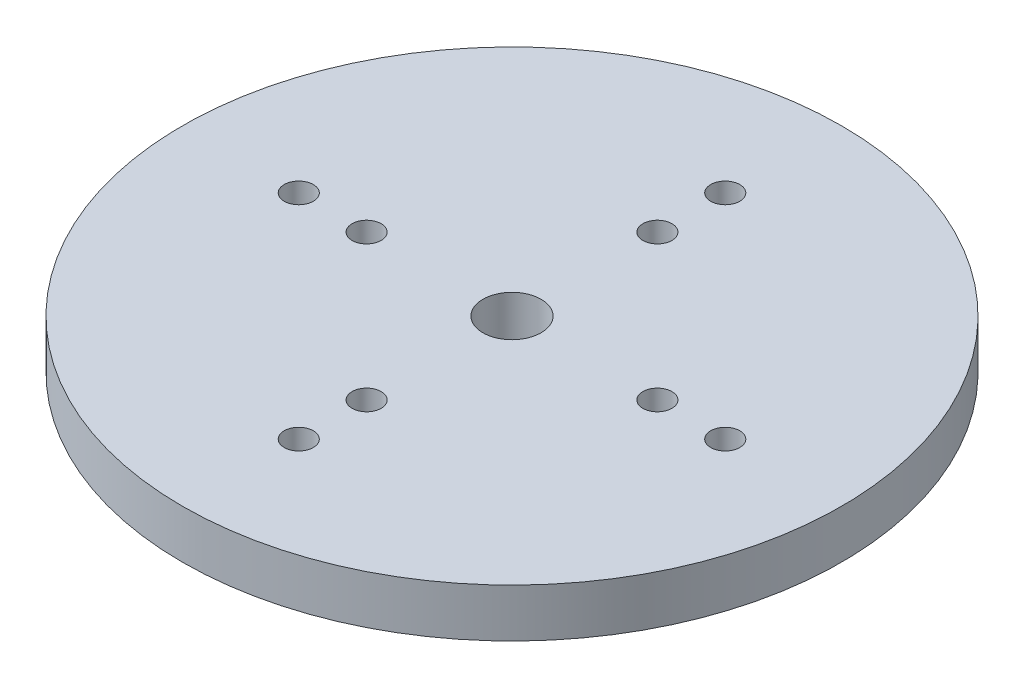
ISO-10303-21;
HEADER;
FILE_DESCRIPTION(('STEP AP214'),'2;1');
FILE_NAME('part.step','',(''),(''),'','','');
FILE_SCHEMA(('AUTOMOTIVE_DESIGN { 1 0 10303 214 1 1 1 1 }'));
ENDSEC;
DATA;
#1=APPLICATION_CONTEXT('core data for automotive mechanical design processes');
#2=APPLICATION_PROTOCOL_DEFINITION('international standard','automotive_design',2000,#1);
#3=PRODUCT_CONTEXT('',#1,'mechanical');
#4=PRODUCT('Part','Part','',(#3));
#5=PRODUCT_RELATED_PRODUCT_CATEGORY('part','',(#4));
#6=PRODUCT_DEFINITION_FORMATION('','',#4);
#7=PRODUCT_DEFINITION_CONTEXT('part definition',#1,'design');
#8=PRODUCT_DEFINITION('design','',#6,#7);
#9=PRODUCT_DEFINITION_SHAPE('','',#8);
#10=(LENGTH_UNIT() NAMED_UNIT(*) SI_UNIT(.MILLI.,.METRE.));
#11=(NAMED_UNIT(*) PLANE_ANGLE_UNIT() SI_UNIT($,.RADIAN.));
#12=(NAMED_UNIT(*) SI_UNIT($,.STERADIAN.) SOLID_ANGLE_UNIT());
#13=UNCERTAINTY_MEASURE_WITH_UNIT(LENGTH_MEASURE(1.E-05),#10,'distance_accuracy_value','');
#14=(GEOMETRIC_REPRESENTATION_CONTEXT(3) GLOBAL_UNCERTAINTY_ASSIGNED_CONTEXT((#13)) GLOBAL_UNIT_ASSIGNED_CONTEXT((#10,
#11,#12)) REPRESENTATION_CONTEXT('',''));
#15=CARTESIAN_POINT('',(0.,0.,0.));
#16=DIRECTION('',(0.,0.,1.));
#17=DIRECTION('',(1.,0.,0.));
#18=AXIS2_PLACEMENT_3D('',#15,#16,#17);
#19=CARTESIAN_POINT('',(0.,5.,0.));
#20=DIRECTION('',(0.,-1.,0.));
#21=DIRECTION('',(0.,0.,-1.));
#22=AXIS2_PLACEMENT_3D('',#19,#20,#21);
#23=CYLINDRICAL_SURFACE('',#22,34.);
#24=CARTESIAN_POINT('',(0.,5.,0.));
#25=DIRECTION('',(0.,1.,0.));
#26=DIRECTION('',(0.,0.,1.));
#27=AXIS2_PLACEMENT_3D('',#24,#25,#26);
#28=CIRCLE('',#27,34.);
#29=CARTESIAN_POINT('',(0.,5.,34.));
#30=VERTEX_POINT('',#29);
#31=EDGE_CURVE('E51',#30,#30,#28,.T.);
#32=ORIENTED_EDGE('',*,*,#31,.F.);
#33=EDGE_LOOP('',(#32));
#34=FACE_BOUND('',#33,.T.);
#35=CARTESIAN_POINT('',(0.,0.,0.));
#36=DIRECTION('',(0.,1.,0.));
#37=DIRECTION('',(0.,0.,1.));
#38=AXIS2_PLACEMENT_3D('',#35,#36,#37);
#39=CIRCLE('',#38,34.);
#40=CARTESIAN_POINT('',(0.,0.,34.));
#41=VERTEX_POINT('',#40);
#42=EDGE_CURVE('E56',#41,#41,#39,.T.);
#43=ORIENTED_EDGE('',*,*,#42,.T.);
#44=EDGE_LOOP('',(#43));
#45=FACE_BOUND('',#44,.T.);
#46=ADVANCED_FACE('F39',(#34,#45),#23,.T.);
#47=CARTESIAN_POINT('',(0.,5.,0.));
#48=DIRECTION('',(0.,1.,0.));
#49=DIRECTION('',(0.,0.,1.));
#50=AXIS2_PLACEMENT_3D('',#47,#48,#49);
#51=PLANE('',#50);
#52=CARTESIAN_POINT('',(0.,5.,0.));
#53=DIRECTION('',(0.,-1.,0.));
#54=DIRECTION('',(0.,0.,-1.));
#55=AXIS2_PLACEMENT_3D('',#52,#53,#54);
#56=CIRCLE('',#55,3.);
#57=CARTESIAN_POINT('',(0.,5.,-3.));
#58=VERTEX_POINT('',#57);
#59=EDGE_CURVE('E337',#58,#58,#56,.T.);
#60=ORIENTED_EDGE('',*,*,#59,.T.);
#61=EDGE_LOOP('',(#60));
#62=FACE_BOUND('',#61,.T.);
#63=CARTESIAN_POINT('',(-1.04744440165294E-13,5.,-15.));
#64=DIRECTION('',(0.,-1.,0.));
#65=DIRECTION('',(0.,0.,-1.));
#66=AXIS2_PLACEMENT_3D('',#63,#64,#65);
#67=CIRCLE('',#66,1.5);
#68=CARTESIAN_POINT('',(-1.04744440165294E-13,5.,-16.5));
#69=VERTEX_POINT('',#68);
#70=EDGE_CURVE('E62',#69,#69,#67,.T.);
#71=ORIENTED_EDGE('',*,*,#70,.T.);
#72=EDGE_LOOP('',(#71));
#73=FACE_BOUND('',#72,.T.);
#74=CARTESIAN_POINT('',(15.,5.,0.));
#75=DIRECTION('',(0.,-1.,0.));
#76=DIRECTION('',(0.,0.,-1.));
#77=AXIS2_PLACEMENT_3D('',#74,#75,#76);
#78=CIRCLE('',#77,1.5);
#79=CARTESIAN_POINT('',(15.,5.,-1.50000000000005));
#80=VERTEX_POINT('',#79);
#81=EDGE_CURVE('E72',#80,#80,#78,.T.);
#82=ORIENTED_EDGE('',*,*,#81,.T.);
#83=EDGE_LOOP('',(#82));
#84=FACE_BOUND('',#83,.T.);
#85=CARTESIAN_POINT('',(0.,5.,15.));
#86=DIRECTION('',(0.,-1.,0.));
#87=DIRECTION('',(0.,0.,-1.));
#88=AXIS2_PLACEMENT_3D('',#85,#86,#87);
#89=CIRCLE('',#88,1.5);
#90=CARTESIAN_POINT('',(0.,5.,13.5));
#91=VERTEX_POINT('',#90);
#92=EDGE_CURVE('E78',#91,#91,#89,.T.);
#93=ORIENTED_EDGE('',*,*,#92,.T.);
#94=EDGE_LOOP('',(#93));
#95=FACE_BOUND('',#94,.T.);
#96=CARTESIAN_POINT('',(-15.,5.,1.57116660247941E-13));
#97=DIRECTION('',(0.,-1.,0.));
#98=DIRECTION('',(0.,0.,-1.));
#99=AXIS2_PLACEMENT_3D('',#96,#97,#98);
#100=CIRCLE('',#99,1.5);
#101=CARTESIAN_POINT('',(-15.,5.,-1.49999999999984));
#102=VERTEX_POINT('',#101);
#103=EDGE_CURVE('E84',#102,#102,#100,.T.);
#104=ORIENTED_EDGE('',*,*,#103,.T.);
#105=EDGE_LOOP('',(#104));
#106=FACE_BOUND('',#105,.T.);
#107=CARTESIAN_POINT('',(0.,5.,22.));
#108=DIRECTION('',(0.,-1.,0.));
#109=DIRECTION('',(0.,0.,-1.));
#110=AXIS2_PLACEMENT_3D('',#107,#108,#109);
#111=CIRCLE('',#110,1.5);
#112=CARTESIAN_POINT('',(0.,5.,20.5));
#113=VERTEX_POINT('',#112);
#114=EDGE_CURVE('E87',#113,#113,#111,.T.);
#115=ORIENTED_EDGE('',*,*,#114,.T.);
#116=EDGE_LOOP('',(#115));
#117=FACE_BOUND('',#116,.T.);
#118=CARTESIAN_POINT('',(-22.,5.,2.30437768363647E-13));
#119=DIRECTION('',(0.,-1.,0.));
#120=DIRECTION('',(0.,0.,-1.));
#121=AXIS2_PLACEMENT_3D('',#118,#119,#120);
#122=CIRCLE('',#121,1.5);
#123=CARTESIAN_POINT('',(-22.,5.,-1.49999999999977));
#124=VERTEX_POINT('',#123);
#125=EDGE_CURVE('E96',#124,#124,#122,.T.);
#126=ORIENTED_EDGE('',*,*,#125,.T.);
#127=EDGE_LOOP('',(#126));
#128=FACE_BOUND('',#127,.T.);
#129=CARTESIAN_POINT('',(-1.53625178909098E-13,5.,-22.));
#130=DIRECTION('',(0.,-1.,0.));
#131=DIRECTION('',(0.,0.,-1.));
#132=AXIS2_PLACEMENT_3D('',#129,#130,#131);
#133=CIRCLE('',#132,1.5);
#134=CARTESIAN_POINT('',(-1.53625178909098E-13,5.,-23.5));
#135=VERTEX_POINT('',#134);
#136=EDGE_CURVE('E102',#135,#135,#133,.T.);
#137=ORIENTED_EDGE('',*,*,#136,.T.);
#138=EDGE_LOOP('',(#137));
#139=FACE_BOUND('',#138,.T.);
#140=CARTESIAN_POINT('',(22.,5.,0.));
#141=DIRECTION('',(0.,-1.,0.));
#142=DIRECTION('',(0.,0.,-1.));
#143=AXIS2_PLACEMENT_3D('',#140,#141,#142);
#144=CIRCLE('',#143,1.5);
#145=CARTESIAN_POINT('',(22.,5.,-1.50000000000008));
#146=VERTEX_POINT('',#145);
#147=EDGE_CURVE('E65',#146,#146,#144,.T.);
#148=ORIENTED_EDGE('',*,*,#147,.T.);
#149=EDGE_LOOP('',(#148));
#150=FACE_BOUND('',#149,.T.);
#151=ORIENTED_EDGE('',*,*,#31,.T.);
#152=EDGE_LOOP('',(#151));
#153=FACE_BOUND('',#152,.T.);
#154=ADVANCED_FACE('F116',(#62,#73,#84,#95,#106,#117,#128,#139,#150,#153),#51,.T.);
#155=CARTESIAN_POINT('',(0.,0.,0.));
#156=DIRECTION('',(0.,1.,0.));
#157=DIRECTION('',(0.,0.,1.));
#158=AXIS2_PLACEMENT_3D('',#155,#156,#157);
#159=PLANE('',#158);
#160=CARTESIAN_POINT('',(0.,0.,0.));
#161=DIRECTION('',(0.,-1.,0.));
#162=DIRECTION('',(0.,0.,-1.));
#163=AXIS2_PLACEMENT_3D('',#160,#161,#162);
#164=CIRCLE('',#163,10.);
#165=CARTESIAN_POINT('',(0.,0.,-10.));
#166=VERTEX_POINT('',#165);
#167=EDGE_CURVE('E10',#166,#166,#164,.T.);
#168=ORIENTED_EDGE('',*,*,#167,.F.);
#169=EDGE_LOOP('',(#168));
#170=FACE_BOUND('',#169,.T.);
#171=CARTESIAN_POINT('',(-1.04744440165294E-13,0.,-15.));
#172=DIRECTION('',(0.,-1.,0.));
#173=DIRECTION('',(0.,0.,-1.));
#174=AXIS2_PLACEMENT_3D('',#171,#172,#173);
#175=CIRCLE('',#174,1.5);
#176=CARTESIAN_POINT('',(-1.04744440165294E-13,0.,-16.5));
#177=VERTEX_POINT('',#176);
#178=EDGE_CURVE('E66',#177,#177,#175,.T.);
#179=ORIENTED_EDGE('',*,*,#178,.F.);
#180=EDGE_LOOP('',(#179));
#181=FACE_BOUND('',#180,.T.);
#182=CARTESIAN_POINT('',(15.,0.,0.));
#183=DIRECTION('',(0.,-1.,0.));
#184=DIRECTION('',(0.,0.,-1.));
#185=AXIS2_PLACEMENT_3D('',#182,#183,#184);
#186=CIRCLE('',#185,1.5);
#187=CARTESIAN_POINT('',(15.,0.,-1.50000000000005));
#188=VERTEX_POINT('',#187);
#189=EDGE_CURVE('E69',#188,#188,#186,.T.);
#190=ORIENTED_EDGE('',*,*,#189,.F.);
#191=EDGE_LOOP('',(#190));
#192=FACE_BOUND('',#191,.T.);
#193=CARTESIAN_POINT('',(0.,0.,15.));
#194=DIRECTION('',(0.,-1.,0.));
#195=DIRECTION('',(0.,0.,-1.));
#196=AXIS2_PLACEMENT_3D('',#193,#194,#195);
#197=CIRCLE('',#196,1.5);
#198=CARTESIAN_POINT('',(0.,0.,13.5));
#199=VERTEX_POINT('',#198);
#200=EDGE_CURVE('E75',#199,#199,#197,.T.);
#201=ORIENTED_EDGE('',*,*,#200,.F.);
#202=EDGE_LOOP('',(#201));
#203=FACE_BOUND('',#202,.T.);
#204=CARTESIAN_POINT('',(-15.,0.,1.57116660247941E-13));
#205=DIRECTION('',(0.,-1.,0.));
#206=DIRECTION('',(0.,0.,-1.));
#207=AXIS2_PLACEMENT_3D('',#204,#205,#206);
#208=CIRCLE('',#207,1.5);
#209=CARTESIAN_POINT('',(-15.,0.,-1.49999999999984));
#210=VERTEX_POINT('',#209);
#211=EDGE_CURVE('E81',#210,#210,#208,.T.);
#212=ORIENTED_EDGE('',*,*,#211,.F.);
#213=EDGE_LOOP('',(#212));
#214=FACE_BOUND('',#213,.T.);
#215=CARTESIAN_POINT('',(0.,0.,22.));
#216=DIRECTION('',(0.,-1.,0.));
#217=DIRECTION('',(0.,0.,-1.));
#218=AXIS2_PLACEMENT_3D('',#215,#216,#217);
#219=CIRCLE('',#218,1.5);
#220=CARTESIAN_POINT('',(0.,0.,20.5));
#221=VERTEX_POINT('',#220);
#222=EDGE_CURVE('E90',#221,#221,#219,.T.);
#223=ORIENTED_EDGE('',*,*,#222,.F.);
#224=EDGE_LOOP('',(#223));
#225=FACE_BOUND('',#224,.T.);
#226=CARTESIAN_POINT('',(-22.,0.,2.30437768363647E-13));
#227=DIRECTION('',(0.,-1.,0.));
#228=DIRECTION('',(0.,0.,-1.));
#229=AXIS2_PLACEMENT_3D('',#226,#227,#228);
#230=CIRCLE('',#229,1.5);
#231=CARTESIAN_POINT('',(-22.,0.,-1.49999999999977));
#232=VERTEX_POINT('',#231);
#233=EDGE_CURVE('E93',#232,#232,#230,.T.);
#234=ORIENTED_EDGE('',*,*,#233,.F.);
#235=EDGE_LOOP('',(#234));
#236=FACE_BOUND('',#235,.T.);
#237=CARTESIAN_POINT('',(-1.53625178909098E-13,0.,-22.));
#238=DIRECTION('',(0.,-1.,0.));
#239=DIRECTION('',(0.,0.,-1.));
#240=AXIS2_PLACEMENT_3D('',#237,#238,#239);
#241=CIRCLE('',#240,1.5);
#242=CARTESIAN_POINT('',(-1.53625178909098E-13,0.,-23.5));
#243=VERTEX_POINT('',#242);
#244=EDGE_CURVE('E99',#243,#243,#241,.T.);
#245=ORIENTED_EDGE('',*,*,#244,.F.);
#246=EDGE_LOOP('',(#245));
#247=FACE_BOUND('',#246,.T.);
#248=CARTESIAN_POINT('',(22.,0.,0.));
#249=DIRECTION('',(0.,-1.,0.));
#250=DIRECTION('',(0.,0.,-1.));
#251=AXIS2_PLACEMENT_3D('',#248,#249,#250);
#252=CIRCLE('',#251,1.5);
#253=CARTESIAN_POINT('',(22.,0.,-1.50000000000008));
#254=VERTEX_POINT('',#253);
#255=EDGE_CURVE('E105',#254,#254,#252,.T.);
#256=ORIENTED_EDGE('',*,*,#255,.F.);
#257=EDGE_LOOP('',(#256));
#258=FACE_BOUND('',#257,.T.);
#259=ORIENTED_EDGE('',*,*,#42,.F.);
#260=EDGE_LOOP('',(#259));
#261=FACE_BOUND('',#260,.T.);
#262=ADVANCED_FACE('F113',(#170,#181,#192,#203,#214,#225,#236,#247,#258,#261),#159,.F.);
#263=CARTESIAN_POINT('',(22.,5.,0.));
#264=DIRECTION('',(0.,-1.,0.));
#265=DIRECTION('',(0.,0.,-1.));
#266=AXIS2_PLACEMENT_3D('',#263,#264,#265);
#267=CYLINDRICAL_SURFACE('',#266,1.5);
#268=ORIENTED_EDGE('',*,*,#147,.F.);
#269=EDGE_LOOP('',(#268));
#270=FACE_BOUND('',#269,.T.);
#271=ORIENTED_EDGE('',*,*,#255,.T.);
#272=EDGE_LOOP('',(#271));
#273=FACE_BOUND('',#272,.T.);
#274=ADVANCED_FACE('F115',(#270,#273),#267,.F.);
#275=CARTESIAN_POINT('',(-1.53625178909098E-13,5.,-22.));
#276=DIRECTION('',(0.,-1.,0.));
#277=DIRECTION('',(0.,0.,-1.));
#278=AXIS2_PLACEMENT_3D('',#275,#276,#277);
#279=CYLINDRICAL_SURFACE('',#278,1.5);
#280=ORIENTED_EDGE('',*,*,#136,.F.);
#281=EDGE_LOOP('',(#280));
#282=FACE_BOUND('',#281,.T.);
#283=ORIENTED_EDGE('',*,*,#244,.T.);
#284=EDGE_LOOP('',(#283));
#285=FACE_BOUND('',#284,.T.);
#286=ADVANCED_FACE('F123',(#282,#285),#279,.F.);
#287=CARTESIAN_POINT('',(-22.,5.,2.30437768363647E-13));
#288=DIRECTION('',(0.,-1.,0.));
#289=DIRECTION('',(0.,0.,-1.));
#290=AXIS2_PLACEMENT_3D('',#287,#288,#289);
#291=CYLINDRICAL_SURFACE('',#290,1.5);
#292=ORIENTED_EDGE('',*,*,#125,.F.);
#293=EDGE_LOOP('',(#292));
#294=FACE_BOUND('',#293,.T.);
#295=ORIENTED_EDGE('',*,*,#233,.T.);
#296=EDGE_LOOP('',(#295));
#297=FACE_BOUND('',#296,.T.);
#298=ADVANCED_FACE('F149',(#294,#297),#291,.F.);
#299=CARTESIAN_POINT('',(0.,5.,22.));
#300=DIRECTION('',(0.,-1.,0.));
#301=DIRECTION('',(0.,0.,-1.));
#302=AXIS2_PLACEMENT_3D('',#299,#300,#301);
#303=CYLINDRICAL_SURFACE('',#302,1.5);
#304=ORIENTED_EDGE('',*,*,#114,.F.);
#305=EDGE_LOOP('',(#304));
#306=FACE_BOUND('',#305,.T.);
#307=ORIENTED_EDGE('',*,*,#222,.T.);
#308=EDGE_LOOP('',(#307));
#309=FACE_BOUND('',#308,.T.);
#310=ADVANCED_FACE('F158',(#306,#309),#303,.F.);
#311=CARTESIAN_POINT('',(-15.,5.,1.57116660247941E-13));
#312=DIRECTION('',(0.,-1.,0.));
#313=DIRECTION('',(0.,0.,-1.));
#314=AXIS2_PLACEMENT_3D('',#311,#312,#313);
#315=CYLINDRICAL_SURFACE('',#314,1.5);
#316=ORIENTED_EDGE('',*,*,#103,.F.);
#317=EDGE_LOOP('',(#316));
#318=FACE_BOUND('',#317,.T.);
#319=ORIENTED_EDGE('',*,*,#211,.T.);
#320=EDGE_LOOP('',(#319));
#321=FACE_BOUND('',#320,.T.);
#322=ADVANCED_FACE('F167',(#318,#321),#315,.F.);
#323=CARTESIAN_POINT('',(0.,5.,15.));
#324=DIRECTION('',(0.,-1.,0.));
#325=DIRECTION('',(0.,0.,-1.));
#326=AXIS2_PLACEMENT_3D('',#323,#324,#325);
#327=CYLINDRICAL_SURFACE('',#326,1.5);
#328=ORIENTED_EDGE('',*,*,#92,.F.);
#329=EDGE_LOOP('',(#328));
#330=FACE_BOUND('',#329,.T.);
#331=ORIENTED_EDGE('',*,*,#200,.T.);
#332=EDGE_LOOP('',(#331));
#333=FACE_BOUND('',#332,.T.);
#334=ADVANCED_FACE('F176',(#330,#333),#327,.F.);
#335=CARTESIAN_POINT('',(15.,5.,0.));
#336=DIRECTION('',(0.,-1.,0.));
#337=DIRECTION('',(0.,0.,-1.));
#338=AXIS2_PLACEMENT_3D('',#335,#336,#337);
#339=CYLINDRICAL_SURFACE('',#338,1.5);
#340=ORIENTED_EDGE('',*,*,#81,.F.);
#341=EDGE_LOOP('',(#340));
#342=FACE_BOUND('',#341,.T.);
#343=ORIENTED_EDGE('',*,*,#189,.T.);
#344=EDGE_LOOP('',(#343));
#345=FACE_BOUND('',#344,.T.);
#346=ADVANCED_FACE('F185',(#342,#345),#339,.F.);
#347=CARTESIAN_POINT('',(-1.04744440165294E-13,5.,-15.));
#348=DIRECTION('',(0.,-1.,0.));
#349=DIRECTION('',(0.,0.,-1.));
#350=AXIS2_PLACEMENT_3D('',#347,#348,#349);
#351=CYLINDRICAL_SURFACE('',#350,1.5);
#352=ORIENTED_EDGE('',*,*,#70,.F.);
#353=EDGE_LOOP('',(#352));
#354=FACE_BOUND('',#353,.T.);
#355=ORIENTED_EDGE('',*,*,#178,.T.);
#356=EDGE_LOOP('',(#355));
#357=FACE_BOUND('',#356,.T.);
#358=ADVANCED_FACE('F193',(#354,#357),#351,.F.);
#359=CARTESIAN_POINT('',(0.,-5.,0.));
#360=DIRECTION('',(0.,1.,0.));
#361=DIRECTION('',(0.,0.,1.));
#362=AXIS2_PLACEMENT_3D('',#359,#360,#361);
#363=CYLINDRICAL_SURFACE('',#362,10.);
#364=CARTESIAN_POINT('',(-1.4735007689594,-2.5,-9.89084402282617));
#365=CARTESIAN_POINT('',(-1.47349730629296,-2.58374556928995,-9.89084541359557));
#366=CARTESIAN_POINT('',(-1.46646087595389,-2.66753975075071,-9.89190071254817));
#367=CARTESIAN_POINT('',(-1.43850878415048,-2.83278531488313,-9.896003454624));
#368=CARTESIAN_POINT('',(-1.4175795850139,-2.91423433148001,-9.89905284082284));
#369=CARTESIAN_POINT('',(-1.36248291155864,-3.0723737554469,-9.906786008431));
#370=CARTESIAN_POINT('',(-1.32832559697322,-3.14906776254216,-9.91146853524788));
#371=CARTESIAN_POINT('',(-1.24776728494114,-3.29562703077208,-9.92193121030236));
#372=CARTESIAN_POINT('',(-1.20136797309554,-3.3654932302143,-9.92771120739854));
#373=CARTESIAN_POINT('',(-1.09724736497384,-3.49698381675433,-9.93975887702279));
#374=CARTESIAN_POINT('',(-1.03944738504928,-3.55854561340674,-9.94602974487523));
#375=CARTESIAN_POINT('',(-0.914337579118461,-3.6711374856555,-9.95830958898905));
#376=CARTESIAN_POINT('',(-0.847027230557552,-3.72216698216699,-9.96431855083605));
#377=CARTESIAN_POINT('',(-0.704407735502633,-3.81247663169136,-9.97541689343224));
#378=CARTESIAN_POINT('',(-0.62906170847757,-3.85169915032246,-9.98050171681002));
#379=CARTESIAN_POINT('',(-0.472762662752764,-3.91691159880817,-9.98912479590269));
#380=CARTESIAN_POINT('',(-0.39180994057063,-3.94290222784289,-9.99266313333332));
#381=CARTESIAN_POINT('',(-0.22724093055899,-3.98072338853084,-9.99775398214815));
#382=CARTESIAN_POINT('',(-0.143649192058036,-3.99265872638716,-9.99932119766269));
#383=CARTESIAN_POINT('',(0.0243627762586975,-4.00235593482489,-10.0003230679557));
#384=CARTESIAN_POINT('',(0.108782959757534,-4.00011859331969,-9.99975784128557));
#385=CARTESIAN_POINT('',(0.275340497084736,-3.98161666223757,-9.99655305765384));
#386=CARTESIAN_POINT('',(0.357490736731513,-3.96546482820851,-9.99393018993386));
#387=CARTESIAN_POINT('',(0.517896619752592,-3.91976939367742,-9.98690305037816));
#388=CARTESIAN_POINT('',(0.596152162830373,-3.89022544849856,-9.98249873269304));
#389=CARTESIAN_POINT('',(0.746889412596694,-3.8184690030829,-9.97235630199583));
#390=CARTESIAN_POINT('',(0.819348174527069,-3.77620903489126,-9.96661320985954));
#391=CARTESIAN_POINT('',(0.956186220660747,-3.68025480633001,-9.95441782808818));
#392=CARTESIAN_POINT('',(1.02056497258533,-3.62655979329313,-9.9479654917834));
#393=CARTESIAN_POINT('',(1.14008137471577,-3.50863155117341,-9.93498217343596));
#394=CARTESIAN_POINT('',(1.1951219176301,-3.44429987802988,-9.92845104200092));
#395=CARTESIAN_POINT('',(1.29364282758511,-3.30725892287626,-9.91609606919497));
#396=CARTESIAN_POINT('',(1.33712312343723,-3.23454958928008,-9.91027223217974));
#397=CARTESIAN_POINT('',(1.41130371953402,-3.08271603705935,-9.89998142345934));
#398=CARTESIAN_POINT('',(1.44199403976479,-3.00358686633761,-9.89551551207501));
#399=CARTESIAN_POINT('',(1.48962683753831,-2.84121474485261,-9.88845777553535));
#400=CARTESIAN_POINT('',(1.50657028398187,-2.75797208445325,-9.88586581830224));
#401=CARTESIAN_POINT('',(1.52609583505582,-2.59059991042251,-9.88287051436306));
#402=CARTESIAN_POINT('',(1.52881553956539,-2.50648681179846,-9.88244619891553));
#403=CARTESIAN_POINT('',(1.52018161476086,-2.33900580518266,-9.88377793139446));
#404=CARTESIAN_POINT('',(1.50882842212817,-2.25563787414923,-9.88553391166645));
#405=CARTESIAN_POINT('',(1.4724872872222,-2.09244018203437,-9.89101170922835));
#406=CARTESIAN_POINT('',(1.44756790037105,-2.0125947950584,-9.89472363931818));
#407=CARTESIAN_POINT('',(1.38487224342306,-1.85821590795139,-9.90369253067097));
#408=CARTESIAN_POINT('',(1.34709533837931,-1.7836826703718,-9.90894956823472));
#409=CARTESIAN_POINT('',(1.25942522362583,-1.64142673966496,-9.92047429025597));
#410=CARTESIAN_POINT('',(1.20944292495753,-1.57375955272018,-9.92674928641613));
#411=CARTESIAN_POINT('',(1.09890326695067,-1.44772714012619,-9.93959254748326));
#412=CARTESIAN_POINT('',(1.03834530963923,-1.38936244081885,-9.94616082895765));
#413=CARTESIAN_POINT('',(0.907765851282424,-1.28309739336642,-9.95893026620427));
#414=CARTESIAN_POINT('',(0.837669714589029,-1.23528827175752,-9.96512790769403));
#415=CARTESIAN_POINT('',(0.690358384995432,-1.15212709473736,-9.97641491450376));
#416=CARTESIAN_POINT('',(0.613143386925981,-1.11677469853497,-9.98150431014167));
#417=CARTESIAN_POINT('',(0.45406986101423,-1.05967625751197,-9.99000179257159));
#418=CARTESIAN_POINT('',(0.372229579216631,-1.03788033292164,-9.99341603302591));
#419=CARTESIAN_POINT('',(0.20599382212565,-1.00835212046253,-9.99822366208568));
#420=CARTESIAN_POINT('',(0.12159851596618,-1.00061890375086,-9.9996171841585));
#421=CARTESIAN_POINT('',(-0.0464670828965501,-0.999458295450598,-10.0002417135246));
#422=CARTESIAN_POINT('',(-0.130136366842589,-1.00589131912303,-9.9994937992926));
#423=CARTESIAN_POINT('',(-0.295194592401998,-1.03258138842076,-9.99598302861495));
#424=CARTESIAN_POINT('',(-0.3765835413117,-1.05283838980856,-9.99322017861722));
#425=CARTESIAN_POINT('',(-0.534731765241522,-1.10655187557024,-9.98600664343958));
#426=CARTESIAN_POINT('',(-0.611494382821061,-1.13999869513893,-9.98155719420326));
#427=CARTESIAN_POINT('',(-0.758343248666628,-1.21912748798315,-9.97147628109765));
#428=CARTESIAN_POINT('',(-0.828429280080115,-1.26480985848034,-9.96584477885481));
#429=CARTESIAN_POINT('',(-0.960642340311664,-1.36761769882918,-9.95397508109166));
#430=CARTESIAN_POINT('',(-1.02268877473654,-1.42484622581634,-9.94773170257136));
#431=CARTESIAN_POINT('',(-1.13634827032203,-1.54890507308047,-9.93539076455104));
#432=CARTESIAN_POINT('',(-1.18795887926649,-1.61573764382435,-9.92929323961987));
#433=CARTESIAN_POINT('',(-1.27954065406191,-1.75754898323254,-9.91790923820481));
#434=CARTESIAN_POINT('',(-1.31944478547318,-1.83257141702183,-9.91262751172895));
#435=CARTESIAN_POINT('',(-1.3860225754293,-1.9882967767633,-9.90353877731809));
#436=CARTESIAN_POINT('',(-1.41270996402456,-2.06899370785782,-9.89973023988344));
#437=CARTESIAN_POINT('',(-1.44603930614594,-2.20837743625648,-9.89490533745734));
#438=CARTESIAN_POINT('',(-1.45632158121709,-2.26620339692427,-9.89339052403444));
#439=CARTESIAN_POINT('',(-1.47005348132787,-2.38267829173435,-9.89135938599805));
#440=CARTESIAN_POINT('',(-1.47350319492992,-2.44132721519961,-9.89084304844251));
#441=CARTESIAN_POINT('',(-1.4735007689594,-2.5,-9.89084402282617));
#442=B_SPLINE_CURVE_WITH_KNOTS('',3,(#364,#365,#366,#367,#368,#369,#370,#371,#372,#373,#374,
#375,#376,#377,#378,#379,#380,#381,#382,#383,#384,#385,#386,#387,#388,#389,#390,#391,#392,#393,
#394,#395,#396,#397,#398,#399,#400,#401,#402,#403,#404,#405,#406,#407,#408,#409,#410,#411,#412,
#413,#414,#415,#416,#417,#418,#419,#420,#421,#422,#423,#424,#425,#426,#427,#428,#429,#430,#431,
#432,#433,#434,#435,#436,#437,#438,#439,#440,#441),.UNSPECIFIED.,.T.,.F.,(4,2,2,2,2,2,2,2,2,2,2,
2,2,2,2,2,2,2,2,2,2,2,2,2,2,2,2,2,2,2,2,2,2,2,2,2,2,2,4),(0.,0.251022251804867,
0.502289469561802,0.753364085335674,1.00440414866132,1.25724158649107,1.51009292207817,
1.76415922105782,2.018212093645,2.27035832534397,2.52249053939374,2.77259862515728,
3.02271314839401,3.27377316386453,3.52484970949272,3.77839544666269,4.0319427451435,
4.28568751773138,4.53941440444341,4.79068214603743,5.04194209099918,5.29194394807374,
5.54195815286117,5.79385486001302,6.04576581461801,6.29977537753515,6.55377799071854,
6.80684040891089,7.05988611170472,7.31044963622326,7.56101235892822,7.81139182257832,
8.06177941567106,8.31450950010968,8.56729890236861,8.82150878824931,9.07545403445563,
9.25132441891612,9.42719252376191),.UNSPECIFIED.);
#443=CARTESIAN_POINT('',(-1.4735007689594,-2.5,-9.89084402282617));
#444=VERTEX_POINT('',#443);
#445=EDGE_CURVE('E330',#444,#444,#442,.T.);
#446=ORIENTED_EDGE('',*,*,#445,.T.);
#447=EDGE_LOOP('',(#446));
#448=FACE_BOUND('',#447,.T.);
#449=CARTESIAN_POINT('',(0.,-5.,0.));
#450=DIRECTION('',(0.,-1.,0.));
#451=DIRECTION('',(0.,0.,-1.));
#452=AXIS2_PLACEMENT_3D('',#449,#450,#451);
#453=CIRCLE('',#452,10.);
#454=CARTESIAN_POINT('',(0.,-5.,-10.));
#455=VERTEX_POINT('',#454);
#456=EDGE_CURVE('E60',#455,#455,#453,.T.);
#457=ORIENTED_EDGE('',*,*,#456,.F.);
#458=EDGE_LOOP('',(#457));
#459=FACE_BOUND('',#458,.T.);
#460=ORIENTED_EDGE('',*,*,#167,.T.);
#461=EDGE_LOOP('',(#460));
#462=FACE_BOUND('',#461,.T.);
#463=ADVANCED_FACE('F201',(#448,#459,#462),#363,.T.);
#464=CARTESIAN_POINT('',(0.,-5.,0.));
#465=DIRECTION('',(0.,-1.,0.));
#466=DIRECTION('',(0.,0.,-1.));
#467=AXIS2_PLACEMENT_3D('',#464,#465,#466);
#468=PLANE('',#467);
#469=CARTESIAN_POINT('',(0.,-5.,0.));
#470=DIRECTION('',(0.,-1.,0.));
#471=DIRECTION('',(0.,0.,-1.));
#472=AXIS2_PLACEMENT_3D('',#469,#470,#471);
#473=CIRCLE('',#472,3.);
#474=CARTESIAN_POINT('',(0.,-5.,-3.));
#475=VERTEX_POINT('',#474);
#476=EDGE_CURVE('E336',#475,#475,#473,.T.);
#477=ORIENTED_EDGE('',*,*,#476,.F.);
#478=EDGE_LOOP('',(#477));
#479=FACE_BOUND('',#478,.T.);
#480=CARTESIAN_POINT('',(-5.5,-5.,-3.985));
#481=DIRECTION('',(0.,-1.,0.));
#482=DIRECTION('',(0.,0.,1.));
#483=AXIS2_PLACEMENT_3D('',#480,#481,#482);
#484=CIRCLE('',#483,2.);
#485=CARTESIAN_POINT('',(-5.5,-5.,-1.985));
#486=VERTEX_POINT('',#485);
#487=EDGE_CURVE('E357',#486,#486,#484,.T.);
#488=ORIENTED_EDGE('',*,*,#487,.F.);
#489=EDGE_LOOP('',(#488));
#490=FACE_BOUND('',#489,.T.);
#491=CARTESIAN_POINT('',(5.5,-5.,-3.985));
#492=DIRECTION('',(0.,-1.,0.));
#493=DIRECTION('',(0.,0.,-1.));
#494=AXIS2_PLACEMENT_3D('',#491,#492,#493);
#495=CIRCLE('',#494,2.);
#496=CARTESIAN_POINT('',(5.5,-5.,-5.985));
#497=VERTEX_POINT('',#496);
#498=EDGE_CURVE('E351',#497,#497,#495,.T.);
#499=ORIENTED_EDGE('',*,*,#498,.F.);
#500=EDGE_LOOP('',(#499));
#501=FACE_BOUND('',#500,.T.);
#502=CARTESIAN_POINT('',(5.5,-5.,3.985));
#503=DIRECTION('',(0.,-1.,0.));
#504=DIRECTION('',(0.,0.,1.));
#505=AXIS2_PLACEMENT_3D('',#502,#503,#504);
#506=CIRCLE('',#505,2.);
#507=CARTESIAN_POINT('',(5.5,-5.,5.985));
#508=VERTEX_POINT('',#507);
#509=EDGE_CURVE('E344',#508,#508,#506,.T.);
#510=ORIENTED_EDGE('',*,*,#509,.F.);
#511=EDGE_LOOP('',(#510));
#512=FACE_BOUND('',#511,.T.);
#513=CARTESIAN_POINT('',(-5.5,-5.,3.985));
#514=DIRECTION('',(0.,-1.,0.));
#515=DIRECTION('',(0.,0.,-1.));
#516=AXIS2_PLACEMENT_3D('',#513,#514,#515);
#517=CIRCLE('',#516,2.);
#518=CARTESIAN_POINT('',(-5.5,-5.,1.985));
#519=VERTEX_POINT('',#518);
#520=EDGE_CURVE('E347',#519,#519,#517,.T.);
#521=ORIENTED_EDGE('',*,*,#520,.F.);
#522=EDGE_LOOP('',(#521));
#523=FACE_BOUND('',#522,.T.);
#524=ORIENTED_EDGE('',*,*,#456,.T.);
#525=EDGE_LOOP('',(#524));
#526=FACE_BOUND('',#525,.T.);
#527=ADVANCED_FACE('F214',(#479,#490,#501,#512,#523,#526),#468,.T.);
#528=CARTESIAN_POINT('',(-5.5,0.,3.985));
#529=DIRECTION('',(0.,-1.,0.));
#530=DIRECTION('',(0.,0.,-1.));
#531=AXIS2_PLACEMENT_3D('',#528,#529,#530);
#532=CYLINDRICAL_SURFACE('',#531,2.);
#533=CARTESIAN_POINT('',(-5.5,0.,3.985));
#534=DIRECTION('',(0.,-1.,0.));
#535=DIRECTION('',(0.,0.,-1.));
#536=AXIS2_PLACEMENT_3D('',#533,#534,#535);
#537=CIRCLE('',#536,2.);
#538=CARTESIAN_POINT('',(-5.5,0.,1.985));
#539=VERTEX_POINT('',#538);
#540=EDGE_CURVE('E362',#539,#539,#537,.T.);
#541=ORIENTED_EDGE('',*,*,#540,.F.);
#542=EDGE_LOOP('',(#541));
#543=FACE_BOUND('',#542,.T.);
#544=ORIENTED_EDGE('',*,*,#520,.T.);
#545=EDGE_LOOP('',(#544));
#546=FACE_BOUND('',#545,.T.);
#547=ADVANCED_FACE('F225',(#543,#546),#532,.F.);
#548=CARTESIAN_POINT('',(-5.5,0.,3.985));
#549=DIRECTION('',(0.,-1.,0.));
#550=DIRECTION('',(0.,0.,-1.));
#551=AXIS2_PLACEMENT_3D('',#548,#549,#550);
#552=PLANE('',#551);
#553=ORIENTED_EDGE('',*,*,#540,.T.);
#554=EDGE_LOOP('',(#553));
#555=FACE_BOUND('',#554,.T.);
#556=ADVANCED_FACE('F234',(#555),#552,.T.);
#557=CARTESIAN_POINT('',(5.5,0.,3.985));
#558=DIRECTION('',(0.,-1.,0.));
#559=DIRECTION('',(0.,0.,-1.));
#560=AXIS2_PLACEMENT_3D('',#557,#558,#559);
#561=CYLINDRICAL_SURFACE('',#560,2.);
#562=CARTESIAN_POINT('',(5.5,0.,3.985));
#563=DIRECTION('',(0.,-1.,0.));
#564=DIRECTION('',(0.,0.,1.));
#565=AXIS2_PLACEMENT_3D('',#562,#563,#564);
#566=CIRCLE('',#565,2.);
#567=CARTESIAN_POINT('',(5.5,0.,5.985));
#568=VERTEX_POINT('',#567);
#569=EDGE_CURVE('E348',#568,#568,#566,.T.);
#570=ORIENTED_EDGE('',*,*,#569,.F.);
#571=EDGE_LOOP('',(#570));
#572=FACE_BOUND('',#571,.T.);
#573=ORIENTED_EDGE('',*,*,#509,.T.);
#574=EDGE_LOOP('',(#573));
#575=FACE_BOUND('',#574,.T.);
#576=ADVANCED_FACE('F244',(#572,#575),#561,.F.);
#577=CARTESIAN_POINT('',(5.5,0.,3.985));
#578=DIRECTION('',(0.,1.,0.));
#579=DIRECTION('',(0.,0.,1.));
#580=AXIS2_PLACEMENT_3D('',#577,#578,#579);
#581=PLANE('',#580);
#582=ORIENTED_EDGE('',*,*,#569,.T.);
#583=EDGE_LOOP('',(#582));
#584=FACE_BOUND('',#583,.T.);
#585=ADVANCED_FACE('F254',(#584),#581,.F.);
#586=CARTESIAN_POINT('',(5.5,0.,-3.985));
#587=DIRECTION('',(0.,-1.,0.));
#588=DIRECTION('',(0.,0.,-1.));
#589=AXIS2_PLACEMENT_3D('',#586,#587,#588);
#590=CYLINDRICAL_SURFACE('',#589,2.);
#591=CARTESIAN_POINT('',(5.5,0.,-3.985));
#592=DIRECTION('',(0.,-1.,0.));
#593=DIRECTION('',(0.,0.,-1.));
#594=AXIS2_PLACEMENT_3D('',#591,#592,#593);
#595=CIRCLE('',#594,2.);
#596=CARTESIAN_POINT('',(5.5,0.,-5.985));
#597=VERTEX_POINT('',#596);
#598=EDGE_CURVE('E354',#597,#597,#595,.T.);
#599=ORIENTED_EDGE('',*,*,#598,.F.);
#600=EDGE_LOOP('',(#599));
#601=FACE_BOUND('',#600,.T.);
#602=ORIENTED_EDGE('',*,*,#498,.T.);
#603=EDGE_LOOP('',(#602));
#604=FACE_BOUND('',#603,.T.);
#605=ADVANCED_FACE('F264',(#601,#604),#590,.F.);
#606=CARTESIAN_POINT('',(5.5,0.,-3.985));
#607=DIRECTION('',(0.,-1.,0.));
#608=DIRECTION('',(0.,0.,-1.));
#609=AXIS2_PLACEMENT_3D('',#606,#607,#608);
#610=PLANE('',#609);
#611=ORIENTED_EDGE('',*,*,#598,.T.);
#612=EDGE_LOOP('',(#611));
#613=FACE_BOUND('',#612,.T.);
#614=ADVANCED_FACE('F274',(#613),#610,.T.);
#615=CARTESIAN_POINT('',(-5.5,0.,-3.985));
#616=DIRECTION('',(0.,-1.,0.));
#617=DIRECTION('',(0.,0.,-1.));
#618=AXIS2_PLACEMENT_3D('',#615,#616,#617);
#619=CYLINDRICAL_SURFACE('',#618,2.);
#620=CARTESIAN_POINT('',(-5.5,0.,-3.985));
#621=DIRECTION('',(0.,-1.,0.));
#622=DIRECTION('',(0.,0.,1.));
#623=AXIS2_PLACEMENT_3D('',#620,#621,#622);
#624=CIRCLE('',#623,2.);
#625=CARTESIAN_POINT('',(-5.5,0.,-1.985));
#626=VERTEX_POINT('',#625);
#627=EDGE_CURVE('E341',#626,#626,#624,.T.);
#628=ORIENTED_EDGE('',*,*,#627,.F.);
#629=EDGE_LOOP('',(#628));
#630=FACE_BOUND('',#629,.T.);
#631=ORIENTED_EDGE('',*,*,#487,.T.);
#632=EDGE_LOOP('',(#631));
#633=FACE_BOUND('',#632,.T.);
#634=ADVANCED_FACE('F284',(#630,#633),#619,.F.);
#635=CARTESIAN_POINT('',(-5.5,0.,-3.985));
#636=DIRECTION('',(0.,1.,0.));
#637=DIRECTION('',(0.,0.,1.));
#638=AXIS2_PLACEMENT_3D('',#635,#636,#637);
#639=PLANE('',#638);
#640=ORIENTED_EDGE('',*,*,#627,.T.);
#641=EDGE_LOOP('',(#640));
#642=FACE_BOUND('',#641,.T.);
#643=ADVANCED_FACE('F294',(#642),#639,.F.);
#644=CARTESIAN_POINT('',(0.,5.,0.));
#645=DIRECTION('',(0.,-1.,0.));
#646=DIRECTION('',(0.,0.,-1.));
#647=AXIS2_PLACEMENT_3D('',#644,#645,#646);
#648=CYLINDRICAL_SURFACE('',#647,3.);
#649=CARTESIAN_POINT('',(0.,-1.0000215425745,-3.));
#650=CARTESIAN_POINT('',(0.078760934535121,-0.999604380422353,-2.99999570063473));
#651=CARTESIAN_POINT('',(0.157648517366023,-1.00541643849007,-2.99686515818934));
#652=CARTESIAN_POINT('',(0.313160049701998,-1.02925443478762,-2.98463460242347));
#653=CARTESIAN_POINT('',(0.389779478751366,-1.04730324791275,-2.97552341013478));
#654=CARTESIAN_POINT('',(0.538266649713989,-1.09473108746266,-2.95226964091647));
#655=CARTESIAN_POINT('',(0.610151370575712,-1.12406671889476,-2.9381463502008));
#656=CARTESIAN_POINT('',(0.74785626602044,-1.19300231975001,-2.906151320021));
#657=CARTESIAN_POINT('',(0.813676892419656,-1.23260152362767,-2.88827986014652));
#658=CARTESIAN_POINT('',(0.941814837997488,-1.32362366706568,-2.84916416184861));
#659=CARTESIAN_POINT('',(1.00368820781136,-1.37561148043781,-2.82778224100744));
#660=CARTESIAN_POINT('',(1.11825297832649,-1.4887396749681,-2.78446914446063));
#661=CARTESIAN_POINT('',(1.17093741080773,-1.54988693723229,-2.76253756622437));
#662=CARTESIAN_POINT('',(1.26982399726154,-1.68538940396722,-2.71858465774553));
#663=CARTESIAN_POINT('',(1.31518346746176,-1.760406841172,-2.69669351805806));
#664=CARTESIAN_POINT('',(1.3924824177124,-1.91819586383427,-2.65760806509054));
#665=CARTESIAN_POINT('',(1.42443085507304,-2.00096222840456,-2.64041061955774));
#666=CARTESIAN_POINT('',(1.47201037264724,-2.1671217846131,-2.61417114842704));
#667=CARTESIAN_POINT('',(1.48846744629125,-2.25021057367637,-2.6047202827948));
#668=CARTESIAN_POINT('',(1.50712163170898,-2.41846021481008,-2.59397628937044));
#669=CARTESIAN_POINT('',(1.50933336348693,-2.50361885243674,-2.59267479790817));
#670=CARTESIAN_POINT('',(1.49999944133462,-2.66253126719782,-2.59807857918287));
#671=CARTESIAN_POINT('',(1.49008162144499,-2.73642129707897,-2.60383666432361));
#672=CARTESIAN_POINT('',(1.45964523096819,-2.88129728552437,-2.62101850212503));
#673=CARTESIAN_POINT('',(1.43912331495937,-2.95228231997771,-2.63244404273112));
#674=CARTESIAN_POINT('',(1.38777896031217,-3.09110790683104,-2.65987336796047));
#675=CARTESIAN_POINT('',(1.35675938776812,-3.15885759668617,-2.67596385692161));
#676=CARTESIAN_POINT('',(1.285452645465,-3.28849836640925,-2.71093836699177));
#677=CARTESIAN_POINT('',(1.24516139392443,-3.35038684893932,-2.72982361716096));
#678=CARTESIAN_POINT('',(1.15050496100172,-3.4748040277111,-2.77115986736306));
#679=CARTESIAN_POINT('',(1.09500381393479,-3.5364219443898,-2.79375961418997));
#680=CARTESIAN_POINT('',(0.974402046128874,-3.64985882978276,-2.83807484632598));
#681=CARTESIAN_POINT('',(0.90929670459387,-3.70167295083692,-2.85978989003555));
#682=CARTESIAN_POINT('',(0.767296746221788,-3.79644592719988,-2.9012036165024));
#683=CARTESIAN_POINT('',(0.689979671387105,-3.83884362242761,-2.92075051283203));
#684=CARTESIAN_POINT('',(0.528091951209209,-3.90968642175513,-2.95430706606371));
#685=CARTESIAN_POINT('',(0.443527013331332,-3.93814238805383,-2.9683210320921));
#686=CARTESIAN_POINT('',(0.276904758224759,-3.97798146615381,-2.98827430759613));
#687=CARTESIAN_POINT('',(0.195202700991461,-3.99056471683673,-2.99477755224861));
#688=CARTESIAN_POINT('',(0.0305999476586332,-4.0020948417342,-3.00097204025223));
#689=CARTESIAN_POINT('',(-0.0523001396656978,-4.00104841419996,-3.00066662963746));
#690=CARTESIAN_POINT('',(-0.20997321147266,-3.98601878622498,-2.99360167135307));
#691=CARTESIAN_POINT('',(-0.284870882377256,-3.97306405638023,-2.98735387421172));
#692=CARTESIAN_POINT('',(-0.431289306362556,-3.93623121932459,-2.96975235154536));
#693=CARTESIAN_POINT('',(-0.502809703071714,-3.9123519621814,-2.95839808850814));
#694=CARTESIAN_POINT('',(-0.642652723323624,-3.85378684163687,-2.93124702358179));
#695=CARTESIAN_POINT('',(-0.710840271119126,-3.81883122282899,-2.91534040774328));
#696=CARTESIAN_POINT('',(-0.840606844783221,-3.73940952793233,-2.88060747440819));
#697=CARTESIAN_POINT('',(-0.902183107758247,-3.6949394987713,-2.86177994421893));
#698=CARTESIAN_POINT('',(-1.02336848443535,-3.59273549310398,-2.82085029424464));
#699=CARTESIAN_POINT('',(-1.08219617442403,-3.53412962864507,-2.79860800393296));
#700=CARTESIAN_POINT('',(-1.18954494197545,-3.40787852432852,-2.75469662689242));
#701=CARTESIAN_POINT('',(-1.23805873305782,-3.34022694852993,-2.733027954808));
#702=CARTESIAN_POINT('',(-1.32573137879927,-3.19349296788396,-2.69163668073862));
#703=CARTESIAN_POINT('',(-1.36429063911032,-3.11400472735968,-2.67206861629026));
#704=CARTESIAN_POINT('',(-1.42707476816084,-2.94838777455044,-2.63907807111998));
#705=CARTESIAN_POINT('',(-1.45131767374388,-2.86226757310282,-2.62564786230268));
#706=CARTESIAN_POINT('',(-1.48257107583701,-2.69445270613676,-2.60811743805785));
#707=CARTESIAN_POINT('',(-1.49098423239012,-2.61310024182612,-2.60326047047611));
#708=CARTESIAN_POINT('',(-1.49441540377774,-2.45003538406551,-2.60129417020104));
#709=CARTESIAN_POINT('',(-1.48943973128943,-2.36832317836662,-2.60418118630744));
#710=CARTESIAN_POINT('',(-1.46755220748307,-2.21527642872981,-2.61656621073134));
#711=CARTESIAN_POINT('',(-1.45185175361729,-2.14370697724731,-2.6253920247248));
#712=CARTESIAN_POINT('',(-1.41050326962833,-2.00430175556881,-2.64783504408849));
#713=CARTESIAN_POINT('',(-1.38485202893986,-1.93646719849005,-2.66145379574134));
#714=CARTESIAN_POINT('',(-1.32249619656248,-1.80161269695986,-2.69300879520554));
#715=CARTESIAN_POINT('',(-1.28518669881443,-1.73492587686243,-2.71116642766196));
#716=CARTESIAN_POINT('',(-1.20122413810282,-1.6083224990673,-2.74939775098261));
#717=CARTESIAN_POINT('',(-1.15456628875246,-1.54840943423696,-2.76947242060913));
#718=CARTESIAN_POINT('',(-1.04654520830184,-1.42942351634525,-2.81220759859859));
#719=CARTESIAN_POINT('',(-0.984081215827177,-1.37135035033945,-2.83488397353478));
#720=CARTESIAN_POINT('',(-0.849699232599644,-1.2662582752658,-2.87801802767948));
#721=CARTESIAN_POINT('',(-0.777775941558544,-1.21924560517333,-2.89847445117577));
#722=CARTESIAN_POINT('',(-0.625304068611213,-1.13740991314265,-2.93516652613351));
#723=CARTESIAN_POINT('',(-0.544676710915117,-1.10271296893912,-2.95135810759485));
#724=CARTESIAN_POINT('',(-0.377782965063258,-1.04781131897367,-2.97730686913157));
#725=CARTESIAN_POINT('',(-0.291533362045127,-1.02756545387754,-2.98708231708647));
#726=CARTESIAN_POINT('',(-0.170303705582428,-1.01024559245668,-2.99535554608244));
#727=CARTESIAN_POINT('',(-0.136375258693319,-1.00657715513786,-2.99709230498857));
#728=CARTESIAN_POINT('',(-0.0683058227108,-1.0015555702972,-2.9994154832926));
#729=CARTESIAN_POINT('',(-0.0341648266854645,-1.00020249868824,-3.00000186497367));
#730=CARTESIAN_POINT('',(0.,-1.0000215425745,-3.));
#731=B_SPLINE_CURVE_WITH_KNOTS('',3,(#649,#650,#651,#652,#653,#654,#655,#656,#657,#658,#659,
#660,#661,#662,#663,#664,#665,#666,#667,#668,#669,#670,#671,#672,#673,#674,#675,#676,#677,#678,
#679,#680,#681,#682,#683,#684,#685,#686,#687,#688,#689,#690,#691,#692,#693,#694,#695,#696,#697,
#698,#699,#700,#701,#702,#703,#704,#705,#706,#707,#708,#709,#710,#711,#712,#713,#714,#715,#716,
#717,#718,#719,#720,#721,#722,#723,#724,#725,#726,#727,#728,#729,#730),.UNSPECIFIED.,.T.,.F.,(4,
2,2,2,2,2,2,2,2,2,2,2,2,2,2,2,2,2,2,2,2,2,2,2,2,2,2,2,2,2,2,2,2,2,2,2,2,2,2,2,4),(0.,
0.236147720719367,0.472738108070647,0.708427810574564,0.944099938370017,1.1938460741611,
1.4437807834696,1.71349037248451,1.9830195330939,2.23719181378135,2.4911031956591,
2.71437632219709,2.93771993085831,3.1655146809602,3.3934099083635,3.65015529553131,
3.90702730511385,4.17653847923051,4.44583933812212,4.69324168943131,4.94052246042717,
5.1682692813947,5.39604008085529,5.6298503767999,5.86375800616763,6.12054296041639,
6.37750872758737,6.64751336628597,6.9171771026208,7.16155573778857,7.40581917146331,
7.62626086362218,7.84677373928534,8.08147214489831,8.3162910253636,8.57984025601038,
8.84353779427581,9.10986186261882,9.37542433096349,9.47785685657644,9.58029274053547),.UNSPECIFIED.);
#732=CARTESIAN_POINT('',(0.,-1.0000215425745,-3.));
#733=VERTEX_POINT('',#732);
#734=EDGE_CURVE('E42',#733,#733,#731,.T.);
#735=ORIENTED_EDGE('',*,*,#734,.T.);
#736=EDGE_LOOP('',(#735));
#737=FACE_BOUND('',#736,.T.);
#738=ORIENTED_EDGE('',*,*,#59,.F.);
#739=EDGE_LOOP('',(#738));
#740=FACE_BOUND('',#739,.T.);
#741=ORIENTED_EDGE('',*,*,#476,.T.);
#742=EDGE_LOOP('',(#741));
#743=FACE_BOUND('',#742,.T.);
#744=ADVANCED_FACE('F304',(#737,#740,#743),#648,.F.);
#745=CARTESIAN_POINT('',(0.0267970270797506,-2.5,-9.99996409590253));
#746=DIRECTION('',(0.00267970270797489,0.,-0.999996409590253));
#747=DIRECTION('',(-0.999996409590253,0.,-0.00267970270797489));
#748=AXIS2_PLACEMENT_3D('',#745,#746,#747);
#749=CYLINDRICAL_SURFACE('',#748,1.5);
#750=ORIENTED_EDGE('',*,*,#734,.F.);
#751=EDGE_LOOP('',(#750));
#752=FACE_BOUND('',#751,.T.);
#753=ORIENTED_EDGE('',*,*,#445,.F.);
#754=EDGE_LOOP('',(#753));
#755=FACE_BOUND('',#754,.T.);
#756=ADVANCED_FACE('F313',(#752,#755),#749,.F.);
#757=CLOSED_SHELL('',(#46,#154,#262,#274,#286,#298,#310,#322,#334,#346,#358,#463,#527,#547,#556,
#576,#585,#605,#614,#634,#643,#744,#756));
#758=MANIFOLD_SOLID_BREP('B2',#757);
#759=ADVANCED_BREP_SHAPE_REPRESENTATION('',(#18,#758),#14);
#760=SHAPE_DEFINITION_REPRESENTATION(#9,#759);
ENDSEC;
END-ISO-10303-21;
